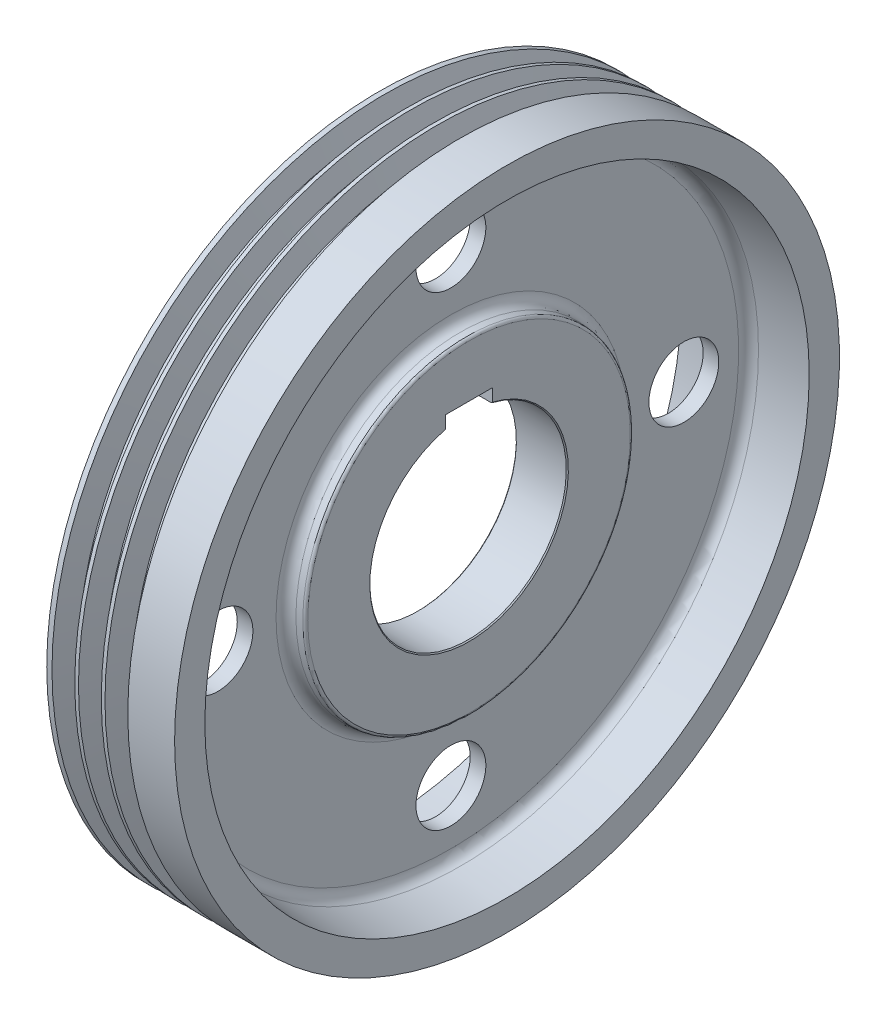
ISO-10303-21;
HEADER;
FILE_DESCRIPTION(('STEP AP214'),'2;1');
FILE_NAME('part.step','',(''),(''),'','','');
FILE_SCHEMA(('AUTOMOTIVE_DESIGN { 1 0 10303 214 1 1 1 1 }'));
ENDSEC;
DATA;
#1=APPLICATION_CONTEXT('core data for automotive mechanical design processes');
#2=APPLICATION_PROTOCOL_DEFINITION('international standard','automotive_design',2000,#1);
#3=PRODUCT_CONTEXT('',#1,'mechanical');
#4=PRODUCT('Part','Part','',(#3));
#5=PRODUCT_RELATED_PRODUCT_CATEGORY('part','',(#4));
#6=PRODUCT_DEFINITION_FORMATION('','',#4);
#7=PRODUCT_DEFINITION_CONTEXT('part definition',#1,'design');
#8=PRODUCT_DEFINITION('design','',#6,#7);
#9=PRODUCT_DEFINITION_SHAPE('','',#8);
#10=(LENGTH_UNIT() NAMED_UNIT(*) SI_UNIT(.MILLI.,.METRE.));
#11=(NAMED_UNIT(*) PLANE_ANGLE_UNIT() SI_UNIT($,.RADIAN.));
#12=(NAMED_UNIT(*) SI_UNIT($,.STERADIAN.) SOLID_ANGLE_UNIT());
#13=UNCERTAINTY_MEASURE_WITH_UNIT(LENGTH_MEASURE(1.E-05),#10,'distance_accuracy_value','');
#14=(GEOMETRIC_REPRESENTATION_CONTEXT(3) GLOBAL_UNCERTAINTY_ASSIGNED_CONTEXT((#13)) GLOBAL_UNIT_ASSIGNED_CONTEXT((#10,
#11,#12)) REPRESENTATION_CONTEXT('',''));
#15=CARTESIAN_POINT('',(0.,0.,0.));
#16=DIRECTION('',(0.,0.,1.));
#17=DIRECTION('',(1.,0.,0.));
#18=AXIS2_PLACEMENT_3D('',#15,#16,#17);
#19=CARTESIAN_POINT('',(54.,159.031051611704,0.));
#20=DIRECTION('',(1.,0.,0.));
#21=DIRECTION('',(0.,0.,-1.));
#22=AXIS2_PLACEMENT_3D('',#19,#20,#21);
#23=PLANE('',#22);
#24=CARTESIAN_POINT('',(54.,0.,0.));
#25=DIRECTION('',(1.,0.,0.));
#26=DIRECTION('',(0.,0.,-1.));
#27=AXIS2_PLACEMENT_3D('',#24,#25,#26);
#28=CIRCLE('',#27,168.194363351878);
#29=CARTESIAN_POINT('',(54.,0.,-168.194363351878));
#30=VERTEX_POINT('',#29);
#31=EDGE_CURVE('E375',#30,#30,#28,.T.);
#32=ORIENTED_EDGE('',*,*,#31,.T.);
#33=EDGE_LOOP('',(#32));
#34=FACE_BOUND('',#33,.T.);
#35=CARTESIAN_POINT('',(54.,0.,0.));
#36=DIRECTION('',(1.,0.,0.));
#37=DIRECTION('',(0.,0.,-1.));
#38=AXIS2_PLACEMENT_3D('',#35,#36,#37);
#39=CIRCLE('',#38,276.812300429426);
#40=CARTESIAN_POINT('',(54.,0.,-276.812300429426));
#41=VERTEX_POINT('',#40);
#42=EDGE_CURVE('E380',#41,#41,#39,.F.);
#43=ORIENTED_EDGE('',*,*,#42,.T.);
#44=EDGE_LOOP('',(#43));
#45=FACE_BOUND('',#44,.T.);
#46=CARTESIAN_POINT('',(54.,224.1,0.));
#47=DIRECTION('',(1.,0.,0.));
#48=DIRECTION('',(0.,0.,-1.));
#49=AXIS2_PLACEMENT_3D('',#46,#47,#48);
#50=CIRCLE('',#49,33.6);
#51=CARTESIAN_POINT('',(54.,224.1,-33.6));
#52=VERTEX_POINT('',#51);
#53=EDGE_CURVE('E403',#52,#52,#50,.F.);
#54=ORIENTED_EDGE('',*,*,#53,.F.);
#55=EDGE_LOOP('',(#54));
#56=FACE_BOUND('',#55,.T.);
#57=CARTESIAN_POINT('',(54.,-7.82440968034746E-13,-224.1));
#58=DIRECTION('',(1.,0.,0.));
#59=DIRECTION('',(0.,0.,-1.));
#60=AXIS2_PLACEMENT_3D('',#57,#58,#59);
#61=CIRCLE('',#60,33.6);
#62=CARTESIAN_POINT('',(54.,-7.82440968034746E-13,-257.7));
#63=VERTEX_POINT('',#62);
#64=EDGE_CURVE('E404',#63,#63,#61,.F.);
#65=ORIENTED_EDGE('',*,*,#64,.F.);
#66=EDGE_LOOP('',(#65));
#67=FACE_BOUND('',#66,.T.);
#68=CARTESIAN_POINT('',(54.,-224.1,1.56488193606949E-12));
#69=DIRECTION('',(1.,0.,0.));
#70=DIRECTION('',(0.,0.,-1.));
#71=AXIS2_PLACEMENT_3D('',#68,#69,#70);
#72=CIRCLE('',#71,33.6);
#73=CARTESIAN_POINT('',(54.,-224.1,-33.5999999999985));
#74=VERTEX_POINT('',#73);
#75=EDGE_CURVE('E407',#74,#74,#72,.F.);
#76=ORIENTED_EDGE('',*,*,#75,.F.);
#77=EDGE_LOOP('',(#76));
#78=FACE_BOUND('',#77,.T.);
#79=CARTESIAN_POINT('',(54.,2.34732290410424E-12,224.1));
#80=DIRECTION('',(1.,0.,0.));
#81=DIRECTION('',(0.,0.,-1.));
#82=AXIS2_PLACEMENT_3D('',#79,#80,#81);
#83=CIRCLE('',#82,33.6);
#84=CARTESIAN_POINT('',(54.,2.34732290410424E-12,190.5));
#85=VERTEX_POINT('',#84);
#86=EDGE_CURVE('E410',#85,#85,#83,.F.);
#87=ORIENTED_EDGE('',*,*,#86,.F.);
#88=EDGE_LOOP('',(#87));
#89=FACE_BOUND('',#88,.T.);
#90=ADVANCED_FACE('F39',(#34,#45,#56,#67,#78,#89),#23,.F.);
#91=CARTESIAN_POINT('',(69.,285.9756121696,0.));
#92=DIRECTION('',(-1.,0.,0.));
#93=DIRECTION('',(0.,0.,1.));
#94=AXIS2_PLACEMENT_3D('',#91,#92,#93);
#95=PLANE('',#94);
#96=CARTESIAN_POINT('',(69.,0.,0.));
#97=DIRECTION('',(-1.,0.,0.));
#98=DIRECTION('',(0.,0.,1.));
#99=AXIS2_PLACEMENT_3D('',#96,#97,#98);
#100=CIRCLE('',#99,168.194363351878);
#101=CARTESIAN_POINT('',(69.,0.,168.194363351878));
#102=VERTEX_POINT('',#101);
#103=EDGE_CURVE('E378',#102,#102,#100,.T.);
#104=ORIENTED_EDGE('',*,*,#103,.T.);
#105=EDGE_LOOP('',(#104));
#106=FACE_BOUND('',#105,.T.);
#107=CARTESIAN_POINT('',(69.,0.,0.));
#108=DIRECTION('',(-1.,0.,0.));
#109=DIRECTION('',(0.,0.,1.));
#110=AXIS2_PLACEMENT_3D('',#107,#108,#109);
#111=CIRCLE('',#110,276.812300429426);
#112=CARTESIAN_POINT('',(69.,0.,276.812300429426));
#113=VERTEX_POINT('',#112);
#114=EDGE_CURVE('E374',#113,#113,#111,.F.);
#115=ORIENTED_EDGE('',*,*,#114,.T.);
#116=EDGE_LOOP('',(#115));
#117=FACE_BOUND('',#116,.T.);
#118=CARTESIAN_POINT('',(69.,224.1,0.));
#119=DIRECTION('',(-1.,0.,0.));
#120=DIRECTION('',(0.,0.,1.));
#121=AXIS2_PLACEMENT_3D('',#118,#119,#120);
#122=CIRCLE('',#121,33.6);
#123=CARTESIAN_POINT('',(69.,224.1,33.6));
#124=VERTEX_POINT('',#123);
#125=EDGE_CURVE('E400',#124,#124,#122,.F.);
#126=ORIENTED_EDGE('',*,*,#125,.F.);
#127=EDGE_LOOP('',(#126));
#128=FACE_BOUND('',#127,.T.);
#129=CARTESIAN_POINT('',(69.,-7.82440968034746E-13,-224.1));
#130=DIRECTION('',(-1.,0.,0.));
#131=DIRECTION('',(0.,0.,1.));
#132=AXIS2_PLACEMENT_3D('',#129,#130,#131);
#133=CIRCLE('',#132,33.6);
#134=CARTESIAN_POINT('',(69.,-7.82440968034746E-13,-190.5));
#135=VERTEX_POINT('',#134);
#136=EDGE_CURVE('E405',#135,#135,#133,.F.);
#137=ORIENTED_EDGE('',*,*,#136,.F.);
#138=EDGE_LOOP('',(#137));
#139=FACE_BOUND('',#138,.T.);
#140=CARTESIAN_POINT('',(69.,-224.1,1.56488193606949E-12));
#141=DIRECTION('',(-1.,0.,0.));
#142=DIRECTION('',(0.,0.,1.));
#143=AXIS2_PLACEMENT_3D('',#140,#141,#142);
#144=CIRCLE('',#143,33.6);
#145=CARTESIAN_POINT('',(69.,-224.1,33.6000000000016));
#146=VERTEX_POINT('',#145);
#147=EDGE_CURVE('E408',#146,#146,#144,.F.);
#148=ORIENTED_EDGE('',*,*,#147,.F.);
#149=EDGE_LOOP('',(#148));
#150=FACE_BOUND('',#149,.T.);
#151=CARTESIAN_POINT('',(69.,2.34732290410424E-12,224.1));
#152=DIRECTION('',(-1.,0.,0.));
#153=DIRECTION('',(0.,0.,1.));
#154=AXIS2_PLACEMENT_3D('',#151,#152,#153);
#155=CIRCLE('',#154,33.6);
#156=CARTESIAN_POINT('',(69.,2.34732290410424E-12,257.7));
#157=VERTEX_POINT('',#156);
#158=EDGE_CURVE('E43',#157,#157,#155,.F.);
#159=ORIENTED_EDGE('',*,*,#158,.F.);
#160=EDGE_LOOP('',(#159));
#161=FACE_BOUND('',#160,.T.);
#162=ADVANCED_FACE('F196',(#106,#117,#128,#139,#150,#161),#95,.F.);
#163=CARTESIAN_POINT('',(0.,0.,0.));
#164=DIRECTION('',(-1.,0.,0.));
#165=DIRECTION('',(0.,0.,1.));
#166=AXIS2_PLACEMENT_3D('',#163,#164,#165);
#167=CYLINDRICAL_SURFACE('',#166,319.8);
#168=CARTESIAN_POINT('',(123.,0.,0.));
#169=DIRECTION('',(-1.,0.,0.));
#170=DIRECTION('',(0.,0.,1.));
#171=AXIS2_PLACEMENT_3D('',#168,#169,#170);
#172=CIRCLE('',#171,319.8);
#173=CARTESIAN_POINT('',(123.,0.,319.8));
#174=VERTEX_POINT('',#173);
#175=EDGE_CURVE('E249',#174,#174,#172,.T.);
#176=ORIENTED_EDGE('',*,*,#175,.T.);
#177=EDGE_LOOP('',(#176));
#178=FACE_BOUND('',#177,.T.);
#179=CARTESIAN_POINT('',(77.9675072710016,0.,0.));
#180=DIRECTION('',(-1.,0.,0.));
#181=DIRECTION('',(0.,0.,1.));
#182=AXIS2_PLACEMENT_3D('',#179,#180,#181);
#183=CIRCLE('',#182,319.8);
#184=CARTESIAN_POINT('',(77.9675072710016,0.,319.8));
#185=VERTEX_POINT('',#184);
#186=EDGE_CURVE('E282',#185,#185,#183,.T.);
#187=ORIENTED_EDGE('',*,*,#186,.F.);
#188=EDGE_LOOP('',(#187));
#189=FACE_BOUND('',#188,.T.);
#190=ADVANCED_FACE('F203',(#178,#189),#167,.T.);
#191=CARTESIAN_POINT('',(52.4675072710016,0.,0.));
#192=DIRECTION('',(-1.,0.,0.));
#193=DIRECTION('',(0.,0.,1.));
#194=AXIS2_PLACEMENT_3D('',#191,#192,#193);
#195=CIRCLE('',#194,319.8);
#196=CARTESIAN_POINT('',(52.4675072710016,0.,319.8));
#197=VERTEX_POINT('',#196);
#198=EDGE_CURVE('E270',#197,#197,#195,.T.);
#199=ORIENTED_EDGE('',*,*,#198,.F.);
#200=EDGE_LOOP('',(#199));
#201=FACE_BOUND('',#200,.T.);
#202=CARTESIAN_POINT('',(56.0324927289984,0.,0.));
#203=DIRECTION('',(-1.,0.,0.));
#204=DIRECTION('',(0.,0.,1.));
#205=AXIS2_PLACEMENT_3D('',#202,#203,#204);
#206=CIRCLE('',#205,319.8);
#207=CARTESIAN_POINT('',(56.0324927289984,0.,319.8));
#208=VERTEX_POINT('',#207);
#209=EDGE_CURVE('E285',#208,#208,#206,.T.);
#210=ORIENTED_EDGE('',*,*,#209,.T.);
#211=EDGE_LOOP('',(#210));
#212=FACE_BOUND('',#211,.T.);
#213=ADVANCED_FACE('F354',(#201,#212),#167,.T.);
#214=CARTESIAN_POINT('',(26.9675072710016,0.,0.));
#215=DIRECTION('',(-1.,0.,0.));
#216=DIRECTION('',(0.,0.,1.));
#217=AXIS2_PLACEMENT_3D('',#214,#215,#216);
#218=CIRCLE('',#217,319.8);
#219=CARTESIAN_POINT('',(26.9675072710016,0.,319.8));
#220=VERTEX_POINT('',#219);
#221=EDGE_CURVE('E258',#220,#220,#218,.T.);
#222=ORIENTED_EDGE('',*,*,#221,.F.);
#223=EDGE_LOOP('',(#222));
#224=FACE_BOUND('',#223,.T.);
#225=CARTESIAN_POINT('',(30.5324927289984,0.,0.));
#226=DIRECTION('',(-1.,0.,0.));
#227=DIRECTION('',(0.,0.,1.));
#228=AXIS2_PLACEMENT_3D('',#225,#226,#227);
#229=CIRCLE('',#228,319.8);
#230=CARTESIAN_POINT('',(30.5324927289984,0.,319.8));
#231=VERTEX_POINT('',#230);
#232=EDGE_CURVE('E273',#231,#231,#229,.T.);
#233=ORIENTED_EDGE('',*,*,#232,.T.);
#234=EDGE_LOOP('',(#233));
#235=FACE_BOUND('',#234,.T.);
#236=ADVANCED_FACE('F227',(#224,#235),#167,.T.);
#237=CARTESIAN_POINT('',(0.,0.,0.));
#238=DIRECTION('',(-1.,0.,0.));
#239=DIRECTION('',(0.,0.,1.));
#240=AXIS2_PLACEMENT_3D('',#237,#238,#239);
#241=CIRCLE('',#240,319.8);
#242=CARTESIAN_POINT('',(0.,0.,319.8));
#243=VERTEX_POINT('',#242);
#244=EDGE_CURVE('E246',#243,#243,#241,.T.);
#245=ORIENTED_EDGE('',*,*,#244,.F.);
#246=EDGE_LOOP('',(#245));
#247=FACE_BOUND('',#246,.T.);
#248=CARTESIAN_POINT('',(5.03249272899842,0.,0.));
#249=DIRECTION('',(-1.,0.,0.));
#250=DIRECTION('',(0.,0.,1.));
#251=AXIS2_PLACEMENT_3D('',#248,#249,#250);
#252=CIRCLE('',#251,319.8);
#253=CARTESIAN_POINT('',(5.03249272899842,0.,319.8));
#254=VERTEX_POINT('',#253);
#255=EDGE_CURVE('E261',#254,#254,#252,.T.);
#256=ORIENTED_EDGE('',*,*,#255,.T.);
#257=EDGE_LOOP('',(#256));
#258=FACE_BOUND('',#257,.T.);
#259=ADVANCED_FACE('F220',(#247,#258),#167,.T.);
#260=CARTESIAN_POINT('',(0.,0.,0.));
#261=DIRECTION('',(-1.,0.,0.));
#262=DIRECTION('',(0.,0.,1.));
#263=AXIS2_PLACEMENT_3D('',#260,#261,#262);
#264=CYLINDRICAL_SURFACE('',#263,94.5);
#265=CARTESIAN_POINT('',(37.5,0.,0.));
#266=DIRECTION('',(1.,0.,0.));
#267=DIRECTION('',(0.,0.,-1.));
#268=AXIS2_PLACEMENT_3D('',#265,#266,#267);
#269=CIRCLE('',#268,94.5);
#270=CARTESIAN_POINT('',(37.5,91.7823512446701,-22.5));
#271=VERTEX_POINT('',#270);
#272=CARTESIAN_POINT('',(37.5,91.7823512446701,22.5));
#273=VERTEX_POINT('',#272);
#274=EDGE_CURVE('E233',#271,#273,#269,.F.);
#275=ORIENTED_EDGE('',*,*,#274,.T.);
#276=DIRECTION('',(-1.,0.,0.));
#277=VECTOR('',#276,1.);
#278=CARTESIAN_POINT('',(123.,91.7823512446701,22.5));
#279=LINE('',#278,#277);
#280=CARTESIAN_POINT('',(85.4999999999999,91.7823512446701,22.5));
#281=VERTEX_POINT('',#280);
#282=EDGE_CURVE('E104',#281,#273,#279,.T.);
#283=ORIENTED_EDGE('',*,*,#282,.F.);
#284=CARTESIAN_POINT('',(85.4999999999999,0.,0.));
#285=DIRECTION('',(-1.,0.,0.));
#286=DIRECTION('',(0.,0.,1.));
#287=AXIS2_PLACEMENT_3D('',#284,#285,#286);
#288=CIRCLE('',#287,94.5);
#289=CARTESIAN_POINT('',(85.4999999999999,91.7823512446701,-22.5));
#290=VERTEX_POINT('',#289);
#291=EDGE_CURVE('E239',#281,#290,#288,.F.);
#292=ORIENTED_EDGE('',*,*,#291,.T.);
#293=DIRECTION('',(-1.,0.,0.));
#294=VECTOR('',#293,1.);
#295=CARTESIAN_POINT('',(123.,91.7823512446701,-22.5));
#296=LINE('',#295,#294);
#297=EDGE_CURVE('E117',#290,#271,#296,.T.);
#298=ORIENTED_EDGE('',*,*,#297,.T.);
#299=EDGE_LOOP('',(#275,#283,#292,#298));
#300=FACE_BOUND('',#299,.T.);
#301=ADVANCED_FACE('F217',(#300),#264,.F.);
#302=CARTESIAN_POINT('',(36.5,94.5,0.));
#303=DIRECTION('',(1.,0.,0.));
#304=DIRECTION('',(0.,0.,-1.));
#305=AXIS2_PLACEMENT_3D('',#302,#303,#304);
#306=PLANE('',#305);
#307=CARTESIAN_POINT('',(36.5,0.,0.));
#308=DIRECTION('',(1.,0.,0.));
#309=DIRECTION('',(0.,0.,-1.));
#310=AXIS2_PLACEMENT_3D('',#307,#308,#309);
#311=CIRCLE('',#310,155.209172064956);
#312=CARTESIAN_POINT('',(36.5,0.,-155.209172064956));
#313=VERTEX_POINT('',#312);
#314=EDGE_CURVE('E48',#313,#313,#311,.F.);
#315=ORIENTED_EDGE('',*,*,#314,.T.);
#316=EDGE_LOOP('',(#315));
#317=FACE_BOUND('',#316,.T.);
#318=CARTESIAN_POINT('',(36.5,0.,0.));
#319=DIRECTION('',(1.,0.,0.));
#320=DIRECTION('',(0.,0.,-1.));
#321=AXIS2_PLACEMENT_3D('',#318,#319,#320);
#322=CIRCLE('',#321,95.5);
#323=CARTESIAN_POINT('',(36.5,92.8116372013769,22.5));
#324=VERTEX_POINT('',#323);
#325=CARTESIAN_POINT('',(36.5,92.8116372013769,-22.5));
#326=VERTEX_POINT('',#325);
#327=EDGE_CURVE('E238',#324,#326,#322,.T.);
#328=ORIENTED_EDGE('',*,*,#327,.T.);
#329=DIRECTION('',(0.,-1.,0.));
#330=VECTOR('',#329,1.);
#331=CARTESIAN_POINT('',(36.5,91.7823512446701,-22.5));
#332=LINE('',#331,#330);
#333=CARTESIAN_POINT('',(36.5,104.89999961853,-22.5));
#334=VERTEX_POINT('',#333);
#335=EDGE_CURVE('E114',#334,#326,#332,.T.);
#336=ORIENTED_EDGE('',*,*,#335,.F.);
#337=DIRECTION('',(0.,0.,-1.));
#338=VECTOR('',#337,1.);
#339=CARTESIAN_POINT('',(36.5,104.89999961853,-22.5));
#340=LINE('',#339,#338);
#341=CARTESIAN_POINT('',(36.5,104.89999961853,22.5));
#342=VERTEX_POINT('',#341);
#343=EDGE_CURVE('E99',#342,#334,#340,.T.);
#344=ORIENTED_EDGE('',*,*,#343,.F.);
#345=DIRECTION('',(0.,1.,0.));
#346=VECTOR('',#345,1.);
#347=CARTESIAN_POINT('',(36.5,91.7823512446701,22.5));
#348=LINE('',#347,#346);
#349=EDGE_CURVE('E107',#324,#342,#348,.T.);
#350=ORIENTED_EDGE('',*,*,#349,.F.);
#351=EDGE_LOOP('',(#328,#336,#344,#350));
#352=FACE_BOUND('',#351,.T.);
#353=ADVANCED_FACE('F116',(#317,#352),#306,.F.);
#354=CARTESIAN_POINT('',(54.,0.,0.));
#355=DIRECTION('',(1.,0.,0.));
#356=DIRECTION('',(0.,0.,-1.));
#357=AXIS2_PLACEMENT_3D('',#354,#355,#356);
#358=CONICAL_SURFACE('',#357,159.031051611704,0.0872664625997099);
#359=CARTESIAN_POINT('',(38.7821106431305,0.,0.));
#360=DIRECTION('',(-1.,0.,0.));
#361=DIRECTION('',(0.,0.,1.));
#362=AXIS2_PLACEMENT_3D('',#359,#360,#361);
#363=CIRCLE('',#362,157.699658810186);
#364=CARTESIAN_POINT('',(38.7821106431305,0.,157.699658810186));
#365=VERTEX_POINT('',#364);
#366=EDGE_CURVE('E11',#365,#365,#363,.F.);
#367=ORIENTED_EDGE('',*,*,#366,.T.);
#368=EDGE_LOOP('',(#367));
#369=FACE_BOUND('',#368,.T.);
#370=CARTESIAN_POINT('',(44.8715574274765,0.,0.));
#371=DIRECTION('',(1.,0.,0.));
#372=DIRECTION('',(0.,0.,-1.));
#373=AXIS2_PLACEMENT_3D('',#370,#371,#372);
#374=CIRCLE('',#373,158.23241637096);
#375=CARTESIAN_POINT('',(44.8715574274765,0.,-158.23241637096));
#376=VERTEX_POINT('',#375);
#377=EDGE_CURVE('E710',#376,#376,#374,.F.);
#378=ORIENTED_EDGE('',*,*,#377,.T.);
#379=EDGE_LOOP('',(#378));
#380=FACE_BOUND('',#379,.T.);
#381=ADVANCED_FACE('F212',(#369,#380),#358,.T.);
#382=CARTESIAN_POINT('',(0.,0.,0.));
#383=DIRECTION('',(-1.,0.,0.));
#384=DIRECTION('',(0.,0.,1.));
#385=AXIS2_PLACEMENT_3D('',#382,#383,#384);
#386=CONICAL_SURFACE('',#385,290.7,0.0872664625997167);
#387=CARTESIAN_POINT('',(44.8715574274766,0.,0.));
#388=DIRECTION('',(-1.,0.,0.));
#389=DIRECTION('',(0.,0.,1.));
#390=AXIS2_PLACEMENT_3D('',#387,#388,#389);
#391=CIRCLE('',#390,286.774247410343);
#392=CARTESIAN_POINT('',(44.8715574274766,0.,286.774247410343));
#393=VERTEX_POINT('',#392);
#394=EDGE_CURVE('E373',#393,#393,#391,.F.);
#395=ORIENTED_EDGE('',*,*,#394,.T.);
#396=EDGE_LOOP('',(#395));
#397=FACE_BOUND('',#396,.T.);
#398=CARTESIAN_POINT('',(0.,0.,0.));
#399=DIRECTION('',(-1.,0.,0.));
#400=DIRECTION('',(0.,0.,1.));
#401=AXIS2_PLACEMENT_3D('',#398,#399,#400);
#402=CIRCLE('',#401,290.7);
#403=CARTESIAN_POINT('',(0.,0.,290.7));
#404=VERTEX_POINT('',#403);
#405=EDGE_CURVE('E241',#404,#404,#402,.T.);
#406=ORIENTED_EDGE('',*,*,#405,.T.);
#407=EDGE_LOOP('',(#406));
#408=FACE_BOUND('',#407,.T.);
#409=ADVANCED_FACE('F210',(#397,#408),#386,.F.);
#410=CARTESIAN_POINT('',(0.,290.7,0.));
#411=DIRECTION('',(1.,0.,0.));
#412=DIRECTION('',(0.,0.,-1.));
#413=AXIS2_PLACEMENT_3D('',#410,#411,#412);
#414=PLANE('',#413);
#415=ORIENTED_EDGE('',*,*,#405,.F.);
#416=EDGE_LOOP('',(#415));
#417=FACE_BOUND('',#416,.T.);
#418=ORIENTED_EDGE('',*,*,#244,.T.);
#419=EDGE_LOOP('',(#418));
#420=FACE_BOUND('',#419,.T.);
#421=ADVANCED_FACE('F351',(#417,#420),#414,.F.);
#422=CARTESIAN_POINT('',(123.,319.8,0.));
#423=DIRECTION('',(-1.,0.,0.));
#424=DIRECTION('',(0.,0.,1.));
#425=AXIS2_PLACEMENT_3D('',#422,#423,#424);
#426=PLANE('',#425);
#427=ORIENTED_EDGE('',*,*,#175,.F.);
#428=EDGE_LOOP('',(#427));
#429=FACE_BOUND('',#428,.T.);
#430=CARTESIAN_POINT('',(123.,0.,0.));
#431=DIRECTION('',(-1.,0.,0.));
#432=DIRECTION('',(0.,0.,1.));
#433=AXIS2_PLACEMENT_3D('',#430,#431,#432);
#434=CIRCLE('',#433,290.7);
#435=CARTESIAN_POINT('',(123.,0.,290.7));
#436=VERTEX_POINT('',#435);
#437=EDGE_CURVE('E252',#436,#436,#434,.T.);
#438=ORIENTED_EDGE('',*,*,#437,.T.);
#439=EDGE_LOOP('',(#438));
#440=FACE_BOUND('',#439,.T.);
#441=ADVANCED_FACE('F348',(#429,#440),#426,.F.);
#442=CARTESIAN_POINT('',(69.,0.,0.));
#443=DIRECTION('',(1.,0.,0.));
#444=DIRECTION('',(0.,0.,-1.));
#445=AXIS2_PLACEMENT_3D('',#442,#443,#444);
#446=CONICAL_SURFACE('',#445,285.9756121696,0.0872664625997106);
#447=CARTESIAN_POINT('',(78.1284425725235,0.,0.));
#448=DIRECTION('',(1.,0.,0.));
#449=DIRECTION('',(0.,0.,-1.));
#450=AXIS2_PLACEMENT_3D('',#447,#448,#449);
#451=CIRCLE('',#450,286.774247410344);
#452=CARTESIAN_POINT('',(78.1284425725235,0.,-286.774247410344));
#453=VERTEX_POINT('',#452);
#454=EDGE_CURVE('E389',#453,#453,#451,.F.);
#455=ORIENTED_EDGE('',*,*,#454,.T.);
#456=EDGE_LOOP('',(#455));
#457=FACE_BOUND('',#456,.T.);
#458=ORIENTED_EDGE('',*,*,#437,.F.);
#459=EDGE_LOOP('',(#458));
#460=FACE_BOUND('',#459,.T.);
#461=ADVANCED_FACE('F343',(#457,#460),#446,.F.);
#462=CARTESIAN_POINT('',(86.5,0.,0.));
#463=DIRECTION('',(-1.,0.,0.));
#464=DIRECTION('',(0.,0.,1.));
#465=AXIS2_PLACEMENT_3D('',#462,#463,#464);
#466=CONICAL_SURFACE('',#465,157.5,0.0872664625997177);
#467=CARTESIAN_POINT('',(84.2178893568693,0.,0.));
#468=DIRECTION('',(1.,0.,0.));
#469=DIRECTION('',(0.,0.,-1.));
#470=AXIS2_PLACEMENT_3D('',#467,#468,#469);
#471=CIRCLE('',#470,157.699658810186);
#472=CARTESIAN_POINT('',(84.2178893568693,0.,-157.699658810186));
#473=VERTEX_POINT('',#472);
#474=EDGE_CURVE('E392',#473,#473,#471,.F.);
#475=ORIENTED_EDGE('',*,*,#474,.T.);
#476=EDGE_LOOP('',(#475));
#477=FACE_BOUND('',#476,.T.);
#478=CARTESIAN_POINT('',(78.1284425725234,0.,0.));
#479=DIRECTION('',(-1.,0.,0.));
#480=DIRECTION('',(0.,0.,1.));
#481=AXIS2_PLACEMENT_3D('',#478,#479,#480);
#482=CIRCLE('',#481,158.23241637096);
#483=CARTESIAN_POINT('',(78.1284425725234,0.,158.23241637096));
#484=VERTEX_POINT('',#483);
#485=EDGE_CURVE('E386',#484,#484,#482,.F.);
#486=ORIENTED_EDGE('',*,*,#485,.T.);
#487=EDGE_LOOP('',(#486));
#488=FACE_BOUND('',#487,.T.);
#489=ADVANCED_FACE('F340',(#477,#488),#466,.T.);
#490=CARTESIAN_POINT('',(86.5,157.5,0.));
#491=DIRECTION('',(-1.,0.,0.));
#492=DIRECTION('',(0.,0.,1.));
#493=AXIS2_PLACEMENT_3D('',#490,#491,#492);
#494=PLANE('',#493);
#495=CARTESIAN_POINT('',(86.5,0.,0.));
#496=DIRECTION('',(-1.,0.,0.));
#497=DIRECTION('',(0.,0.,1.));
#498=AXIS2_PLACEMENT_3D('',#495,#496,#497);
#499=CIRCLE('',#498,155.209172064956);
#500=CARTESIAN_POINT('',(86.5,0.,155.209172064956));
#501=VERTEX_POINT('',#500);
#502=EDGE_CURVE('E395',#501,#501,#499,.F.);
#503=ORIENTED_EDGE('',*,*,#502,.T.);
#504=EDGE_LOOP('',(#503));
#505=FACE_BOUND('',#504,.T.);
#506=DIRECTION('',(0.,0.,-1.));
#507=VECTOR('',#506,1.);
#508=CARTESIAN_POINT('',(86.5,104.89999961853,0.));
#509=LINE('',#508,#507);
#510=CARTESIAN_POINT('',(86.5,104.89999961853,22.5));
#511=VERTEX_POINT('',#510);
#512=CARTESIAN_POINT('',(86.5,104.89999961853,-22.5));
#513=VERTEX_POINT('',#512);
#514=EDGE_CURVE('E102',#511,#513,#509,.T.);
#515=ORIENTED_EDGE('',*,*,#514,.T.);
#516=DIRECTION('',(0.,-1.,0.));
#517=VECTOR('',#516,1.);
#518=CARTESIAN_POINT('',(86.5,157.5,-22.5));
#519=LINE('',#518,#517);
#520=CARTESIAN_POINT('',(86.5,92.811637201377,-22.5));
#521=VERTEX_POINT('',#520);
#522=EDGE_CURVE('E133',#513,#521,#519,.T.);
#523=ORIENTED_EDGE('',*,*,#522,.T.);
#524=CARTESIAN_POINT('',(86.5,0.,0.));
#525=DIRECTION('',(-1.,0.,0.));
#526=DIRECTION('',(0.,0.,1.));
#527=AXIS2_PLACEMENT_3D('',#524,#525,#526);
#528=CIRCLE('',#527,95.5000000000001);
#529=CARTESIAN_POINT('',(86.5,92.811637201377,22.5));
#530=VERTEX_POINT('',#529);
#531=EDGE_CURVE('E157',#521,#530,#528,.T.);
#532=ORIENTED_EDGE('',*,*,#531,.T.);
#533=DIRECTION('',(0.,1.,0.));
#534=VECTOR('',#533,1.);
#535=CARTESIAN_POINT('',(86.5,157.5,22.5));
#536=LINE('',#535,#534);
#537=EDGE_CURVE('E56',#530,#511,#536,.T.);
#538=ORIENTED_EDGE('',*,*,#537,.T.);
#539=EDGE_LOOP('',(#515,#523,#532,#538));
#540=FACE_BOUND('',#539,.T.);
#541=ADVANCED_FACE('F298',(#505,#540),#494,.F.);
#542=CARTESIAN_POINT('',(0.,0.,0.));
#543=DIRECTION('',(-1.,0.,0.));
#544=DIRECTION('',(0.,0.,1.));
#545=AXIS2_PLACEMENT_3D('',#542,#543,#544);
#546=CYLINDRICAL_SURFACE('',#545,300.7);
#547=CARTESIAN_POINT('',(21.1280512551412,0.,0.));
#548=DIRECTION('',(-1.,0.,0.));
#549=DIRECTION('',(0.,0.,1.));
#550=AXIS2_PLACEMENT_3D('',#547,#548,#549);
#551=CIRCLE('',#550,300.7);
#552=CARTESIAN_POINT('',(21.1280512551412,0.,300.7));
#553=VERTEX_POINT('',#552);
#554=EDGE_CURVE('E255',#553,#553,#551,.T.);
#555=ORIENTED_EDGE('',*,*,#554,.T.);
#556=EDGE_LOOP('',(#555));
#557=FACE_BOUND('',#556,.T.);
#558=CARTESIAN_POINT('',(10.8719487448588,0.,0.));
#559=DIRECTION('',(-1.,0.,0.));
#560=DIRECTION('',(0.,0.,1.));
#561=AXIS2_PLACEMENT_3D('',#558,#559,#560);
#562=CIRCLE('',#561,300.7);
#563=CARTESIAN_POINT('',(10.8719487448588,0.,300.7));
#564=VERTEX_POINT('',#563);
#565=EDGE_CURVE('E264',#564,#564,#562,.T.);
#566=ORIENTED_EDGE('',*,*,#565,.F.);
#567=EDGE_LOOP('',(#566));
#568=FACE_BOUND('',#567,.T.);
#569=ADVANCED_FACE('F334',(#557,#568),#546,.T.);
#570=CARTESIAN_POINT('',(21.1280512551412,0.,0.));
#571=DIRECTION('',(1.,0.,0.));
#572=DIRECTION('',(0.,0.,-1.));
#573=AXIS2_PLACEMENT_3D('',#570,#571,#572);
#574=CONICAL_SURFACE('',#573,300.7,1.27409035395586);
#575=ORIENTED_EDGE('',*,*,#221,.T.);
#576=EDGE_LOOP('',(#575));
#577=FACE_BOUND('',#576,.T.);
#578=ORIENTED_EDGE('',*,*,#554,.F.);
#579=EDGE_LOOP('',(#578));
#580=FACE_BOUND('',#579,.T.);
#581=ADVANCED_FACE('F330',(#577,#580),#574,.T.);
#582=CARTESIAN_POINT('',(5.03249272899842,0.,0.));
#583=DIRECTION('',(-1.,0.,0.));
#584=DIRECTION('',(0.,0.,1.));
#585=AXIS2_PLACEMENT_3D('',#582,#583,#584);
#586=CONICAL_SURFACE('',#585,319.8,1.27409035395586);
#587=ORIENTED_EDGE('',*,*,#565,.T.);
#588=EDGE_LOOP('',(#587));
#589=FACE_BOUND('',#588,.T.);
#590=ORIENTED_EDGE('',*,*,#255,.F.);
#591=EDGE_LOOP('',(#590));
#592=FACE_BOUND('',#591,.T.);
#593=ADVANCED_FACE('F326',(#589,#592),#586,.T.);
#594=CARTESIAN_POINT('',(25.5,0.,0.));
#595=DIRECTION('',(-1.,0.,0.));
#596=DIRECTION('',(0.,0.,1.));
#597=AXIS2_PLACEMENT_3D('',#594,#595,#596);
#598=CYLINDRICAL_SURFACE('',#597,300.7);
#599=CARTESIAN_POINT('',(46.6280512551412,0.,0.));
#600=DIRECTION('',(-1.,0.,0.));
#601=DIRECTION('',(0.,0.,1.));
#602=AXIS2_PLACEMENT_3D('',#599,#600,#601);
#603=CIRCLE('',#602,300.7);
#604=CARTESIAN_POINT('',(46.6280512551412,0.,300.7));
#605=VERTEX_POINT('',#604);
#606=EDGE_CURVE('E267',#605,#605,#603,.T.);
#607=ORIENTED_EDGE('',*,*,#606,.T.);
#608=EDGE_LOOP('',(#607));
#609=FACE_BOUND('',#608,.T.);
#610=CARTESIAN_POINT('',(36.3719487448588,0.,0.));
#611=DIRECTION('',(-1.,0.,0.));
#612=DIRECTION('',(0.,0.,1.));
#613=AXIS2_PLACEMENT_3D('',#610,#611,#612);
#614=CIRCLE('',#613,300.7);
#615=CARTESIAN_POINT('',(36.3719487448588,0.,300.7));
#616=VERTEX_POINT('',#615);
#617=EDGE_CURVE('E276',#616,#616,#614,.T.);
#618=ORIENTED_EDGE('',*,*,#617,.F.);
#619=EDGE_LOOP('',(#618));
#620=FACE_BOUND('',#619,.T.);
#621=ADVANCED_FACE('F322',(#609,#620),#598,.T.);
#622=CARTESIAN_POINT('',(46.6280512551412,0.,0.));
#623=DIRECTION('',(1.,0.,0.));
#624=DIRECTION('',(0.,0.,-1.));
#625=AXIS2_PLACEMENT_3D('',#622,#623,#624);
#626=CONICAL_SURFACE('',#625,300.7,1.27409035395586);
#627=ORIENTED_EDGE('',*,*,#198,.T.);
#628=EDGE_LOOP('',(#627));
#629=FACE_BOUND('',#628,.T.);
#630=ORIENTED_EDGE('',*,*,#606,.F.);
#631=EDGE_LOOP('',(#630));
#632=FACE_BOUND('',#631,.T.);
#633=ADVANCED_FACE('F318',(#629,#632),#626,.T.);
#634=CARTESIAN_POINT('',(30.5324927289984,0.,0.));
#635=DIRECTION('',(-1.,0.,0.));
#636=DIRECTION('',(0.,0.,1.));
#637=AXIS2_PLACEMENT_3D('',#634,#635,#636);
#638=CONICAL_SURFACE('',#637,319.8,1.27409035395586);
#639=ORIENTED_EDGE('',*,*,#617,.T.);
#640=EDGE_LOOP('',(#639));
#641=FACE_BOUND('',#640,.T.);
#642=ORIENTED_EDGE('',*,*,#232,.F.);
#643=EDGE_LOOP('',(#642));
#644=FACE_BOUND('',#643,.T.);
#645=ADVANCED_FACE('F314',(#641,#644),#638,.T.);
#646=CARTESIAN_POINT('',(51.,0.,0.));
#647=DIRECTION('',(-1.,0.,0.));
#648=DIRECTION('',(0.,0.,1.));
#649=AXIS2_PLACEMENT_3D('',#646,#647,#648);
#650=CYLINDRICAL_SURFACE('',#649,300.7);
#651=CARTESIAN_POINT('',(72.1280512551412,0.,0.));
#652=DIRECTION('',(-1.,0.,0.));
#653=DIRECTION('',(0.,0.,1.));
#654=AXIS2_PLACEMENT_3D('',#651,#652,#653);
#655=CIRCLE('',#654,300.7);
#656=CARTESIAN_POINT('',(72.1280512551412,0.,300.7));
#657=VERTEX_POINT('',#656);
#658=EDGE_CURVE('E279',#657,#657,#655,.T.);
#659=ORIENTED_EDGE('',*,*,#658,.T.);
#660=EDGE_LOOP('',(#659));
#661=FACE_BOUND('',#660,.T.);
#662=CARTESIAN_POINT('',(61.8719487448588,0.,0.));
#663=DIRECTION('',(-1.,0.,0.));
#664=DIRECTION('',(0.,0.,1.));
#665=AXIS2_PLACEMENT_3D('',#662,#663,#664);
#666=CIRCLE('',#665,300.7);
#667=CARTESIAN_POINT('',(61.8719487448588,0.,300.7));
#668=VERTEX_POINT('',#667);
#669=EDGE_CURVE('E288',#668,#668,#666,.T.);
#670=ORIENTED_EDGE('',*,*,#669,.F.);
#671=EDGE_LOOP('',(#670));
#672=FACE_BOUND('',#671,.T.);
#673=ADVANCED_FACE('F307',(#661,#672),#650,.T.);
#674=CARTESIAN_POINT('',(72.1280512551412,0.,0.));
#675=DIRECTION('',(1.,0.,0.));
#676=DIRECTION('',(0.,0.,-1.));
#677=AXIS2_PLACEMENT_3D('',#674,#675,#676);
#678=CONICAL_SURFACE('',#677,300.7,1.27409035395586);
#679=ORIENTED_EDGE('',*,*,#186,.T.);
#680=EDGE_LOOP('',(#679));
#681=FACE_BOUND('',#680,.T.);
#682=ORIENTED_EDGE('',*,*,#658,.F.);
#683=EDGE_LOOP('',(#682));
#684=FACE_BOUND('',#683,.T.);
#685=ADVANCED_FACE('F302',(#681,#684),#678,.T.);
#686=CARTESIAN_POINT('',(56.0324927289984,0.,0.));
#687=DIRECTION('',(-1.,0.,0.));
#688=DIRECTION('',(0.,0.,1.));
#689=AXIS2_PLACEMENT_3D('',#686,#687,#688);
#690=CONICAL_SURFACE('',#689,319.8,1.27409035395586);
#691=ORIENTED_EDGE('',*,*,#669,.T.);
#692=EDGE_LOOP('',(#691));
#693=FACE_BOUND('',#692,.T.);
#694=ORIENTED_EDGE('',*,*,#209,.F.);
#695=EDGE_LOOP('',(#694));
#696=FACE_BOUND('',#695,.T.);
#697=ADVANCED_FACE('F299',(#693,#696),#690,.T.);
#698=CARTESIAN_POINT('',(37.5,0.,0.));
#699=DIRECTION('',(-1.,0.,0.));
#700=DIRECTION('',(0.,0.,1.));
#701=AXIS2_PLACEMENT_3D('',#698,#699,#700);
#702=CONICAL_SURFACE('',#701,94.5,0.785398163397462);
#703=CARTESIAN_POINT('',(31.9108630440766,97.5273568624805,-22.5));
#704=CARTESIAN_POINT('',(32.7638469726148,96.651965537108,-22.5));
#705=CARTESIAN_POINT('',(33.6165350394659,95.7762858473821,-22.5));
#706=CARTESIAN_POINT('',(35.32126487843,94.0242987167131,-22.5));
#707=CARTESIAN_POINT('',(36.1733066509586,93.1479912761745,-22.5));
#708=CARTESIAN_POINT('',(37.8766905116702,91.3946964085921,-22.5));
#709=CARTESIAN_POINT('',(38.7280325997847,90.5177089814817,-22.5));
#710=CARTESIAN_POINT('',(40.4299536307065,88.7629928644472,-22.5));
#711=CARTESIAN_POINT('',(41.280532573022,87.8852641740461,-22.5));
#712=CARTESIAN_POINT('',(42.1306977054101,87.0071347357006,-22.5));
#713=B_SPLINE_CURVE_WITH_KNOTS('',3,(#703,#704,#705,#706,#707,#708,#709,#710,#711,#712),
.UNSPECIFIED.,.F.,.F.,(4,2,2,2,4),(0.,3.66674570331357,7.33348904609329,11.000232747802,
14.6669788107846),.UNSPECIFIED.);
#714=EDGE_CURVE('E290',#326,#271,#713,.T.);
#715=ORIENTED_EDGE('',*,*,#714,.F.);
#716=ORIENTED_EDGE('',*,*,#327,.F.);
#717=CARTESIAN_POINT('',(42.1306977054101,87.0071347357006,22.5));
#718=CARTESIAN_POINT('',(41.280532573022,87.8852641740461,22.5));
#719=CARTESIAN_POINT('',(40.4299536307065,88.7629928644472,22.5));
#720=CARTESIAN_POINT('',(38.7280325997848,90.5177089814817,22.5));
#721=CARTESIAN_POINT('',(37.8766905116703,91.3946964085921,22.5));
#722=CARTESIAN_POINT('',(36.1733066509586,93.1479912761745,22.5));
#723=CARTESIAN_POINT('',(35.32126487843,94.0242987167131,22.5));
#724=CARTESIAN_POINT('',(33.6165350394659,95.7762858473821,22.5));
#725=CARTESIAN_POINT('',(32.7638469726148,96.651965537108,22.5));
#726=CARTESIAN_POINT('',(31.9108630440766,97.5273568624805,22.5));
#727=B_SPLINE_CURVE_WITH_KNOTS('',3,(#717,#718,#719,#720,#721,#722,#723,#724,#725,#726),
.UNSPECIFIED.,.F.,.F.,(4,2,2,2,4),(0.,3.66674606298259,7.33348976469135,11.0002331074711,
14.6669788107846),.UNSPECIFIED.);
#728=EDGE_CURVE('E110',#273,#324,#727,.T.);
#729=ORIENTED_EDGE('',*,*,#728,.F.);
#730=ORIENTED_EDGE('',*,*,#274,.F.);
#731=EDGE_LOOP('',(#715,#716,#729,#730));
#732=FACE_BOUND('',#731,.T.);
#733=ADVANCED_FACE('F135',(#732),#702,.F.);
#734=CARTESIAN_POINT('',(86.5,0.,0.));
#735=DIRECTION('',(1.,0.,0.));
#736=DIRECTION('',(0.,0.,-1.));
#737=AXIS2_PLACEMENT_3D('',#734,#735,#736);
#738=CONICAL_SURFACE('',#737,95.5000000000001,0.785398163397448);
#739=CARTESIAN_POINT('',(80.8693022945895,87.0071347357005,-22.5));
#740=CARTESIAN_POINT('',(81.7194674269776,87.885264174046,-22.5));
#741=CARTESIAN_POINT('',(82.5700463692932,88.7629928644472,-22.5));
#742=CARTESIAN_POINT('',(84.2719674002151,90.5177089814817,-22.5));
#743=CARTESIAN_POINT('',(85.1233094883297,91.3946964085921,-22.5));
#744=CARTESIAN_POINT('',(86.8266933490414,93.1479912761746,-22.5));
#745=CARTESIAN_POINT('',(87.6787351215701,94.0242987167131,-22.5));
#746=CARTESIAN_POINT('',(89.3834649605342,95.7762858473822,-22.5));
#747=CARTESIAN_POINT('',(90.2361530273854,96.6519655371082,-22.5));
#748=CARTESIAN_POINT('',(91.0891369559236,97.5273568624807,-22.5));
#749=B_SPLINE_CURVE_WITH_KNOTS('',3,(#739,#740,#741,#742,#743,#744,#745,#746,#747,#748),
.UNSPECIFIED.,.F.,.F.,(4,2,2,2,4),(0.,3.66674606298279,7.33348976469171,11.0002331074716,
14.6669788107853),.UNSPECIFIED.);
#750=EDGE_CURVE('E64',#290,#521,#749,.T.);
#751=ORIENTED_EDGE('',*,*,#750,.F.);
#752=ORIENTED_EDGE('',*,*,#291,.F.);
#753=CARTESIAN_POINT('',(91.0891369559236,97.5273568624807,22.5));
#754=CARTESIAN_POINT('',(90.2361530273854,96.6519655371082,22.5));
#755=CARTESIAN_POINT('',(89.3834649605342,95.7762858473822,22.5));
#756=CARTESIAN_POINT('',(87.67873512157,94.0242987167131,22.5));
#757=CARTESIAN_POINT('',(86.8266933490413,93.1479912761746,22.5));
#758=CARTESIAN_POINT('',(85.1233094883296,91.3946964085921,22.5));
#759=CARTESIAN_POINT('',(84.2719674002151,90.5177089814817,22.5));
#760=CARTESIAN_POINT('',(82.5700463692932,88.7629928644472,22.5));
#761=CARTESIAN_POINT('',(81.7194674269776,87.885264174046,22.5));
#762=CARTESIAN_POINT('',(80.8693022945895,87.0071347357005,22.5));
#763=B_SPLINE_CURVE_WITH_KNOTS('',3,(#753,#754,#755,#756,#757,#758,#759,#760,#761,#762),
.UNSPECIFIED.,.F.,.F.,(4,2,2,2,4),(0.,3.66674570331375,7.33348904609362,11.0002327478025,
14.6669788107853),.UNSPECIFIED.);
#764=EDGE_CURVE('E150',#530,#281,#763,.T.);
#765=ORIENTED_EDGE('',*,*,#764,.F.);
#766=ORIENTED_EDGE('',*,*,#531,.F.);
#767=EDGE_LOOP('',(#751,#752,#765,#766));
#768=FACE_BOUND('',#767,.T.);
#769=ADVANCED_FACE('F164',(#768),#738,.F.);
#770=CARTESIAN_POINT('',(123.,104.89999961853,-22.5));
#771=DIRECTION('',(0.,1.,0.));
#772=DIRECTION('',(0.,0.,1.));
#773=AXIS2_PLACEMENT_3D('',#770,#771,#772);
#774=PLANE('',#773);
#775=DIRECTION('',(-1.,0.,0.));
#776=VECTOR('',#775,1.);
#777=CARTESIAN_POINT('',(123.,104.89999961853,22.5));
#778=LINE('',#777,#776);
#779=EDGE_CURVE('E94',#511,#342,#778,.T.);
#780=ORIENTED_EDGE('',*,*,#779,.T.);
#781=ORIENTED_EDGE('',*,*,#343,.T.);
#782=DIRECTION('',(-1.,0.,0.));
#783=VECTOR('',#782,1.);
#784=CARTESIAN_POINT('',(123.,104.89999961853,-22.5));
#785=LINE('',#784,#783);
#786=EDGE_CURVE('E103',#513,#334,#785,.T.);
#787=ORIENTED_EDGE('',*,*,#786,.F.);
#788=ORIENTED_EDGE('',*,*,#514,.F.);
#789=EDGE_LOOP('',(#780,#781,#787,#788));
#790=FACE_BOUND('',#789,.T.);
#791=ADVANCED_FACE('F96',(#790),#774,.F.);
#792=CARTESIAN_POINT('',(123.,91.7823512446701,-22.5));
#793=DIRECTION('',(0.,0.,-1.));
#794=DIRECTION('',(-1.,0.,0.));
#795=AXIS2_PLACEMENT_3D('',#792,#793,#794);
#796=PLANE('',#795);
#797=ORIENTED_EDGE('',*,*,#714,.T.);
#798=ORIENTED_EDGE('',*,*,#297,.F.);
#799=ORIENTED_EDGE('',*,*,#750,.T.);
#800=ORIENTED_EDGE('',*,*,#522,.F.);
#801=ORIENTED_EDGE('',*,*,#786,.T.);
#802=ORIENTED_EDGE('',*,*,#335,.T.);
#803=EDGE_LOOP('',(#797,#798,#799,#800,#801,#802));
#804=FACE_BOUND('',#803,.T.);
#805=ADVANCED_FACE('F144',(#804),#796,.F.);
#806=CARTESIAN_POINT('',(123.,91.7823512446701,22.5));
#807=DIRECTION('',(0.,0.,1.));
#808=DIRECTION('',(1.,0.,0.));
#809=AXIS2_PLACEMENT_3D('',#806,#807,#808);
#810=PLANE('',#809);
#811=ORIENTED_EDGE('',*,*,#728,.T.);
#812=ORIENTED_EDGE('',*,*,#349,.T.);
#813=ORIENTED_EDGE('',*,*,#779,.F.);
#814=ORIENTED_EDGE('',*,*,#537,.F.);
#815=ORIENTED_EDGE('',*,*,#764,.T.);
#816=ORIENTED_EDGE('',*,*,#282,.T.);
#817=EDGE_LOOP('',(#811,#812,#813,#814,#815,#816));
#818=FACE_BOUND('',#817,.T.);
#819=ADVANCED_FACE('F108',(#818),#810,.F.);
#820=CARTESIAN_POINT('',(44.,0.,0.));
#821=DIRECTION('',(1.,0.,0.));
#822=DIRECTION('',(0.,0.,-1.));
#823=AXIS2_PLACEMENT_3D('',#820,#821,#822);
#824=TOROIDAL_SURFACE('',#823,168.194363351878,10.);
#825=ORIENTED_EDGE('',*,*,#31,.F.);
#826=EDGE_LOOP('',(#825));
#827=FACE_BOUND('',#826,.T.);
#828=ORIENTED_EDGE('',*,*,#377,.F.);
#829=EDGE_LOOP('',(#828));
#830=FACE_BOUND('',#829,.T.);
#831=ADVANCED_FACE('F143',(#827,#830),#824,.F.);
#832=CARTESIAN_POINT('',(44.,0.,0.));
#833=DIRECTION('',(1.,0.,0.));
#834=DIRECTION('',(0.,0.,-1.));
#835=AXIS2_PLACEMENT_3D('',#832,#833,#834);
#836=TOROIDAL_SURFACE('',#835,276.812300429426,10.);
#837=ORIENTED_EDGE('',*,*,#394,.F.);
#838=EDGE_LOOP('',(#837));
#839=FACE_BOUND('',#838,.T.);
#840=ORIENTED_EDGE('',*,*,#42,.F.);
#841=EDGE_LOOP('',(#840));
#842=FACE_BOUND('',#841,.T.);
#843=ADVANCED_FACE('F172',(#839,#842),#836,.F.);
#844=CARTESIAN_POINT('',(79.,0.,0.));
#845=DIRECTION('',(-1.,0.,0.));
#846=DIRECTION('',(0.,0.,1.));
#847=AXIS2_PLACEMENT_3D('',#844,#845,#846);
#848=TOROIDAL_SURFACE('',#847,168.194363351878,10.);
#849=ORIENTED_EDGE('',*,*,#485,.F.);
#850=EDGE_LOOP('',(#849));
#851=FACE_BOUND('',#850,.T.);
#852=ORIENTED_EDGE('',*,*,#103,.F.);
#853=EDGE_LOOP('',(#852));
#854=FACE_BOUND('',#853,.T.);
#855=ADVANCED_FACE('F176',(#851,#854),#848,.F.);
#856=CARTESIAN_POINT('',(79.,0.,0.));
#857=DIRECTION('',(-1.,0.,0.));
#858=DIRECTION('',(0.,0.,1.));
#859=AXIS2_PLACEMENT_3D('',#856,#857,#858);
#860=TOROIDAL_SURFACE('',#859,276.812300429426,10.);
#861=ORIENTED_EDGE('',*,*,#114,.F.);
#862=EDGE_LOOP('',(#861));
#863=FACE_BOUND('',#862,.T.);
#864=ORIENTED_EDGE('',*,*,#454,.F.);
#865=EDGE_LOOP('',(#864));
#866=FACE_BOUND('',#865,.T.);
#867=ADVANCED_FACE('F180',(#863,#866),#860,.F.);
#868=CARTESIAN_POINT('',(84.,0.,0.));
#869=DIRECTION('',(-1.,0.,0.));
#870=DIRECTION('',(0.,0.,1.));
#871=AXIS2_PLACEMENT_3D('',#868,#869,#870);
#872=TOROIDAL_SURFACE('',#871,155.209172064956,2.5);
#873=ORIENTED_EDGE('',*,*,#502,.F.);
#874=EDGE_LOOP('',(#873));
#875=FACE_BOUND('',#874,.T.);
#876=ORIENTED_EDGE('',*,*,#474,.F.);
#877=EDGE_LOOP('',(#876));
#878=FACE_BOUND('',#877,.T.);
#879=ADVANCED_FACE('F183',(#875,#878),#872,.T.);
#880=CARTESIAN_POINT('',(39.,0.,0.));
#881=DIRECTION('',(1.,0.,0.));
#882=DIRECTION('',(0.,0.,-1.));
#883=AXIS2_PLACEMENT_3D('',#880,#881,#882);
#884=TOROIDAL_SURFACE('',#883,155.209172064956,2.5);
#885=ORIENTED_EDGE('',*,*,#366,.F.);
#886=EDGE_LOOP('',(#885));
#887=FACE_BOUND('',#886,.T.);
#888=ORIENTED_EDGE('',*,*,#314,.F.);
#889=EDGE_LOOP('',(#888));
#890=FACE_BOUND('',#889,.T.);
#891=ADVANCED_FACE('F41',(#887,#890),#884,.T.);
#892=CARTESIAN_POINT('',(123.,224.1,0.));
#893=DIRECTION('',(-1.,0.,0.));
#894=DIRECTION('',(0.,0.,1.));
#895=AXIS2_PLACEMENT_3D('',#892,#893,#894);
#896=CYLINDRICAL_SURFACE('',#895,33.6);
#897=ORIENTED_EDGE('',*,*,#125,.T.);
#898=EDGE_LOOP('',(#897));
#899=FACE_BOUND('',#898,.T.);
#900=ORIENTED_EDGE('',*,*,#53,.T.);
#901=EDGE_LOOP('',(#900));
#902=FACE_BOUND('',#901,.T.);
#903=ADVANCED_FACE('F191',(#899,#902),#896,.F.);
#904=CARTESIAN_POINT('',(123.,-7.82440968034746E-13,-224.1));
#905=DIRECTION('',(-1.,0.,0.));
#906=DIRECTION('',(0.,0.,1.));
#907=AXIS2_PLACEMENT_3D('',#904,#905,#906);
#908=CYLINDRICAL_SURFACE('',#907,33.6);
#909=ORIENTED_EDGE('',*,*,#136,.T.);
#910=EDGE_LOOP('',(#909));
#911=FACE_BOUND('',#910,.T.);
#912=ORIENTED_EDGE('',*,*,#64,.T.);
#913=EDGE_LOOP('',(#912));
#914=FACE_BOUND('',#913,.T.);
#915=ADVANCED_FACE('F616',(#911,#914),#908,.F.);
#916=CARTESIAN_POINT('',(123.,-224.1,1.56488193606949E-12));
#917=DIRECTION('',(-1.,0.,0.));
#918=DIRECTION('',(0.,0.,1.));
#919=AXIS2_PLACEMENT_3D('',#916,#917,#918);
#920=CYLINDRICAL_SURFACE('',#919,33.6);
#921=ORIENTED_EDGE('',*,*,#147,.T.);
#922=EDGE_LOOP('',(#921));
#923=FACE_BOUND('',#922,.T.);
#924=ORIENTED_EDGE('',*,*,#75,.T.);
#925=EDGE_LOOP('',(#924));
#926=FACE_BOUND('',#925,.T.);
#927=ADVANCED_FACE('F633',(#923,#926),#920,.F.);
#928=CARTESIAN_POINT('',(123.,2.34732290410424E-12,224.1));
#929=DIRECTION('',(-1.,0.,0.));
#930=DIRECTION('',(0.,0.,1.));
#931=AXIS2_PLACEMENT_3D('',#928,#929,#930);
#932=CYLINDRICAL_SURFACE('',#931,33.6);
#933=ORIENTED_EDGE('',*,*,#158,.T.);
#934=EDGE_LOOP('',(#933));
#935=FACE_BOUND('',#934,.T.);
#936=ORIENTED_EDGE('',*,*,#86,.T.);
#937=EDGE_LOOP('',(#936));
#938=FACE_BOUND('',#937,.T.);
#939=ADVANCED_FACE('F642',(#935,#938),#932,.F.);
#940=CLOSED_SHELL('',(#90,#162,#190,#213,#236,#259,#301,#353,#381,#409,#421,#441,#461,#489,#541,
#569,#581,#593,#621,#633,#645,#673,#685,#697,#733,#769,#791,#805,#819,#831,#843,#855,#867,#879,
#891,#903,#915,#927,#939));
#941=MANIFOLD_SOLID_BREP('B2',#940);
#942=ADVANCED_BREP_SHAPE_REPRESENTATION('',(#18,#941),#14);
#943=SHAPE_DEFINITION_REPRESENTATION(#9,#942);
ENDSEC;
END-ISO-10303-21;
